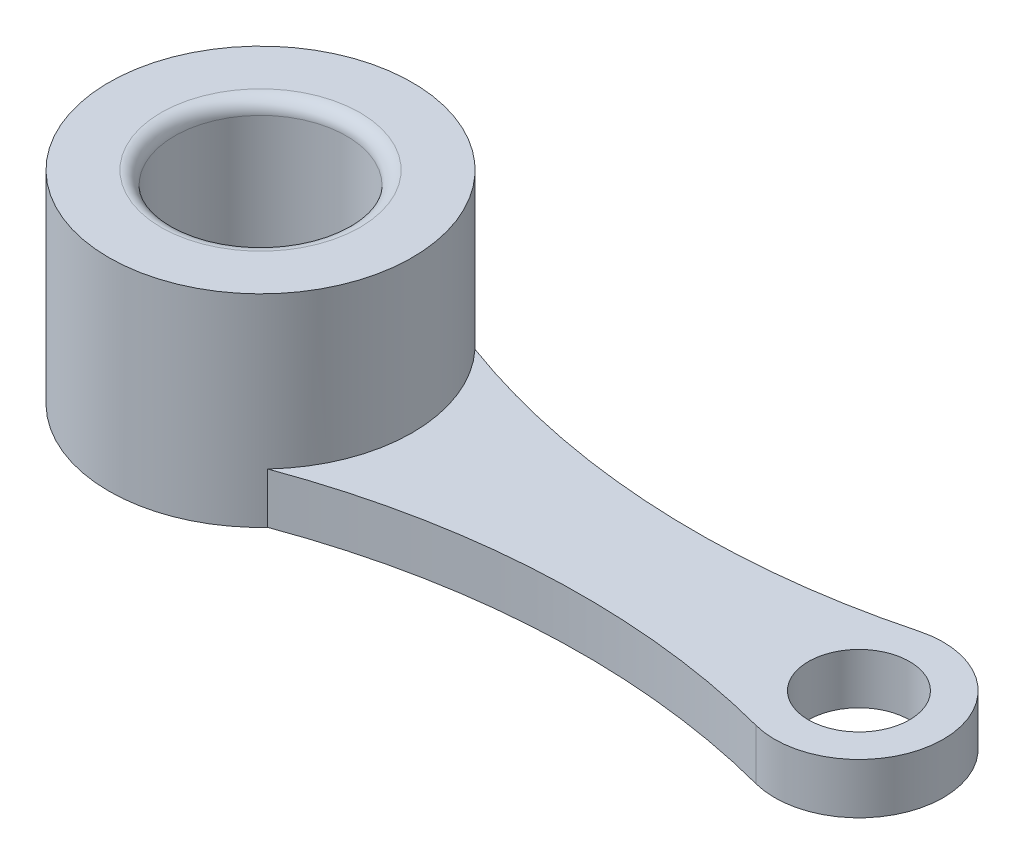
ISO-10303-21;
HEADER;
FILE_DESCRIPTION(('STEP AP214'),'2;1');
FILE_NAME('part.step','',(''),(''),'','','');
FILE_SCHEMA(('AUTOMOTIVE_DESIGN { 1 0 10303 214 1 1 1 1 }'));
ENDSEC;
DATA;
#1=APPLICATION_CONTEXT('core data for automotive mechanical design processes');
#2=APPLICATION_PROTOCOL_DEFINITION('international standard','automotive_design',2000,#1);
#3=PRODUCT_CONTEXT('',#1,'mechanical');
#4=PRODUCT('Part','Part','',(#3));
#5=PRODUCT_RELATED_PRODUCT_CATEGORY('part','',(#4));
#6=PRODUCT_DEFINITION_FORMATION('','',#4);
#7=PRODUCT_DEFINITION_CONTEXT('part definition',#1,'design');
#8=PRODUCT_DEFINITION('design','',#6,#7);
#9=PRODUCT_DEFINITION_SHAPE('','',#8);
#10=(LENGTH_UNIT() NAMED_UNIT(*) SI_UNIT(.MILLI.,.METRE.));
#11=(NAMED_UNIT(*) PLANE_ANGLE_UNIT() SI_UNIT($,.RADIAN.));
#12=(NAMED_UNIT(*) SI_UNIT($,.STERADIAN.) SOLID_ANGLE_UNIT());
#13=UNCERTAINTY_MEASURE_WITH_UNIT(LENGTH_MEASURE(1.E-05),#10,'distance_accuracy_value','');
#14=(GEOMETRIC_REPRESENTATION_CONTEXT(3) GLOBAL_UNCERTAINTY_ASSIGNED_CONTEXT((#13)) GLOBAL_UNIT_ASSIGNED_CONTEXT((#10,
#11,#12)) REPRESENTATION_CONTEXT('',''));
#15=CARTESIAN_POINT('',(0.,0.,0.));
#16=DIRECTION('',(0.,0.,1.));
#17=DIRECTION('',(1.,0.,0.));
#18=AXIS2_PLACEMENT_3D('',#15,#16,#17);
#19=CARTESIAN_POINT('',(0.,6.,0.));
#20=DIRECTION('',(0.,1.,0.));
#21=DIRECTION('',(0.,0.,1.));
#22=AXIS2_PLACEMENT_3D('',#19,#20,#21);
#23=PLANE('',#22);
#24=CARTESIAN_POINT('',(4.5,6.,-4.5));
#25=DIRECTION('',(0.,1.,0.));
#26=DIRECTION('',(0.,0.,1.));
#27=AXIS2_PLACEMENT_3D('',#24,#25,#26);
#28=CIRCLE('',#27,2.95);
#29=CARTESIAN_POINT('',(4.5,6.,-1.55));
#30=VERTEX_POINT('',#29);
#31=EDGE_CURVE('E11',#30,#30,#28,.F.);
#32=ORIENTED_EDGE('',*,*,#31,.T.);
#33=EDGE_LOOP('',(#32));
#34=FACE_BOUND('',#33,.T.);
#35=CARTESIAN_POINT('',(4.5,6.,-4.5));
#36=DIRECTION('',(0.,1.,0.));
#37=DIRECTION('',(0.,0.,1.));
#38=AXIS2_PLACEMENT_3D('',#35,#36,#37);
#39=CIRCLE('',#38,4.5);
#40=CARTESIAN_POINT('',(4.5,6.,0.));
#41=VERTEX_POINT('',#40);
#42=EDGE_CURVE('E110',#41,#41,#39,.T.);
#43=ORIENTED_EDGE('',*,*,#42,.T.);
#44=EDGE_LOOP('',(#43));
#45=FACE_BOUND('',#44,.T.);
#46=ADVANCED_FACE('F39',(#34,#45),#23,.T.);
#47=CARTESIAN_POINT('',(0.,0.,0.));
#48=DIRECTION('',(0.,1.,0.));
#49=DIRECTION('',(0.,0.,1.));
#50=AXIS2_PLACEMENT_3D('',#47,#48,#49);
#51=PLANE('',#50);
#52=CARTESIAN_POINT('',(4.5,0.,-4.5));
#53=DIRECTION('',(0.,-1.,0.));
#54=DIRECTION('',(0.,0.,-1.));
#55=AXIS2_PLACEMENT_3D('',#52,#53,#54);
#56=CIRCLE('',#55,1.);
#57=CARTESIAN_POINT('',(4.5,0.,-5.5));
#58=VERTEX_POINT('',#57);
#59=EDGE_CURVE('E199',#58,#58,#56,.T.);
#60=ORIENTED_EDGE('',*,*,#59,.F.);
#61=EDGE_LOOP('',(#60));
#62=FACE_BOUND('',#61,.T.);
#63=CARTESIAN_POINT('',(22.25,0.,-4.5));
#64=DIRECTION('',(0.,1.,0.));
#65=DIRECTION('',(0.,0.,1.));
#66=AXIS2_PLACEMENT_3D('',#63,#64,#65);
#67=CIRCLE('',#66,1.5);
#68=CARTESIAN_POINT('',(22.25,0.,-3.));
#69=VERTEX_POINT('',#68);
#70=EDGE_CURVE('E115',#69,#69,#67,.T.);
#71=ORIENTED_EDGE('',*,*,#70,.T.);
#72=EDGE_LOOP('',(#71));
#73=FACE_BOUND('',#72,.T.);
#74=CARTESIAN_POINT('',(15.7411640579091,0.,20.1776280007804));
#75=DIRECTION('',(0.,1.,0.));
#76=DIRECTION('',(0.,0.,1.));
#77=AXIS2_PLACEMENT_3D('',#74,#75,#76);
#78=CIRCLE('',#77,23.0215647848238);
#79=CARTESIAN_POINT('',(21.6124180181576,0.,-2.08266898906461));
#80=VERTEX_POINT('',#79);
#81=CARTESIAN_POINT('',(7.7863381531722,0.,-1.42591777224409));
#82=VERTEX_POINT('',#81);
#83=EDGE_CURVE('E63',#80,#82,#78,.T.);
#84=ORIENTED_EDGE('',*,*,#83,.T.);
#85=CARTESIAN_POINT('',(4.5,0.,-4.5));
#86=DIRECTION('',(0.,1.,0.));
#87=DIRECTION('',(0.,0.,1.));
#88=AXIS2_PLACEMENT_3D('',#85,#86,#87);
#89=CIRCLE('',#88,4.5);
#90=CARTESIAN_POINT('',(7.78633815317218,0.,-7.57408222775593));
#91=VERTEX_POINT('',#90);
#92=EDGE_CURVE('E56',#91,#82,#89,.T.);
#93=ORIENTED_EDGE('',*,*,#92,.F.);
#94=CARTESIAN_POINT('',(15.7411640579091,0.,-29.1776280007804));
#95=DIRECTION('',(0.,1.,0.));
#96=DIRECTION('',(0.,0.,1.));
#97=AXIS2_PLACEMENT_3D('',#94,#95,#96);
#98=CIRCLE('',#97,23.0215647848238);
#99=CARTESIAN_POINT('',(21.6124180181576,0.,-6.91733101093539));
#100=VERTEX_POINT('',#99);
#101=EDGE_CURVE('E89',#100,#91,#98,.F.);
#102=ORIENTED_EDGE('',*,*,#101,.F.);
#103=CARTESIAN_POINT('',(22.25,0.,-4.5));
#104=DIRECTION('',(0.,1.,0.));
#105=DIRECTION('',(0.,0.,1.));
#106=AXIS2_PLACEMENT_3D('',#103,#104,#105);
#107=CIRCLE('',#106,2.5);
#108=EDGE_CURVE('E195',#80,#100,#107,.T.);
#109=ORIENTED_EDGE('',*,*,#108,.F.);
#110=EDGE_LOOP('',(#84,#93,#102,#109));
#111=FACE_BOUND('',#110,.T.);
#112=ADVANCED_FACE('F149',(#62,#73,#111),#51,.F.);
#113=CARTESIAN_POINT('',(22.25,0.,-4.5));
#114=DIRECTION('',(0.,1.,0.));
#115=DIRECTION('',(0.,0.,1.));
#116=AXIS2_PLACEMENT_3D('',#113,#114,#115);
#117=CYLINDRICAL_SURFACE('',#116,1.5);
#118=ORIENTED_EDGE('',*,*,#70,.F.);
#119=EDGE_LOOP('',(#118));
#120=FACE_BOUND('',#119,.T.);
#121=CARTESIAN_POINT('',(22.25,1.5,-4.5));
#122=DIRECTION('',(0.,1.,0.));
#123=DIRECTION('',(0.,0.,1.));
#124=AXIS2_PLACEMENT_3D('',#121,#122,#123);
#125=CIRCLE('',#124,1.5);
#126=CARTESIAN_POINT('',(22.25,1.5,-3.));
#127=VERTEX_POINT('',#126);
#128=EDGE_CURVE('E109',#127,#127,#125,.F.);
#129=ORIENTED_EDGE('',*,*,#128,.F.);
#130=EDGE_LOOP('',(#129));
#131=FACE_BOUND('',#130,.T.);
#132=ADVANCED_FACE('F155',(#120,#131),#117,.F.);
#133=CARTESIAN_POINT('',(4.5,1.,-4.5));
#134=DIRECTION('',(0.,1.,0.));
#135=DIRECTION('',(0.,0.,1.));
#136=AXIS2_PLACEMENT_3D('',#133,#134,#135);
#137=CYLINDRICAL_SURFACE('',#136,2.55);
#138=CARTESIAN_POINT('',(4.5,5.6,-4.5));
#139=DIRECTION('',(0.,1.,0.));
#140=DIRECTION('',(0.,0.,1.));
#141=AXIS2_PLACEMENT_3D('',#138,#139,#140);
#142=CIRCLE('',#141,2.55);
#143=CARTESIAN_POINT('',(4.5,5.6,-1.95));
#144=VERTEX_POINT('',#143);
#145=EDGE_CURVE('E49',#144,#144,#142,.T.);
#146=ORIENTED_EDGE('',*,*,#145,.T.);
#147=EDGE_LOOP('',(#146));
#148=FACE_BOUND('',#147,.T.);
#149=CARTESIAN_POINT('',(4.5,1.,-4.5));
#150=DIRECTION('',(0.,1.,0.));
#151=DIRECTION('',(0.,0.,1.));
#152=AXIS2_PLACEMENT_3D('',#149,#150,#151);
#153=CIRCLE('',#152,2.55);
#154=CARTESIAN_POINT('',(4.5,1.,-1.95));
#155=VERTEX_POINT('',#154);
#156=EDGE_CURVE('E125',#155,#155,#153,.T.);
#157=ORIENTED_EDGE('',*,*,#156,.F.);
#158=EDGE_LOOP('',(#157));
#159=FACE_BOUND('',#158,.T.);
#160=ADVANCED_FACE('F133',(#148,#159),#137,.F.);
#161=CARTESIAN_POINT('',(4.5,1.,-4.5));
#162=DIRECTION('',(0.,1.,0.));
#163=DIRECTION('',(0.,0.,1.));
#164=AXIS2_PLACEMENT_3D('',#161,#162,#163);
#165=PLANE('',#164);
#166=CARTESIAN_POINT('',(4.5,1.,-4.5));
#167=DIRECTION('',(0.,1.,0.));
#168=DIRECTION('',(0.,0.,1.));
#169=AXIS2_PLACEMENT_3D('',#166,#167,#168);
#170=CIRCLE('',#169,1.);
#171=CARTESIAN_POINT('',(4.5,1.,-3.5));
#172=VERTEX_POINT('',#171);
#173=EDGE_CURVE('E43',#172,#172,#170,.T.);
#174=ORIENTED_EDGE('',*,*,#173,.F.);
#175=EDGE_LOOP('',(#174));
#176=FACE_BOUND('',#175,.T.);
#177=ORIENTED_EDGE('',*,*,#156,.T.);
#178=EDGE_LOOP('',(#177));
#179=FACE_BOUND('',#178,.T.);
#180=ADVANCED_FACE('F161',(#176,#179),#165,.T.);
#181=CARTESIAN_POINT('',(4.5,1.5,-4.5));
#182=DIRECTION('',(0.,1.,0.));
#183=DIRECTION('',(0.,0.,1.));
#184=AXIS2_PLACEMENT_3D('',#181,#182,#183);
#185=CYLINDRICAL_SURFACE('',#184,4.5);
#186=ORIENTED_EDGE('',*,*,#42,.F.);
#187=EDGE_LOOP('',(#186));
#188=FACE_BOUND('',#187,.T.);
#189=ORIENTED_EDGE('',*,*,#92,.T.);
#190=DIRECTION('',(0.,1.,0.));
#191=VECTOR('',#190,1.);
#192=CARTESIAN_POINT('',(7.7863381531722,-8.5,-1.42591777224409));
#193=LINE('',#192,#191);
#194=CARTESIAN_POINT('',(7.7863381531722,1.5,-1.42591777224409));
#195=VERTEX_POINT('',#194);
#196=EDGE_CURVE('E106',#82,#195,#193,.T.);
#197=ORIENTED_EDGE('',*,*,#196,.T.);
#198=CARTESIAN_POINT('',(4.5,1.5,-4.5));
#199=DIRECTION('',(0.,1.,0.));
#200=DIRECTION('',(0.,0.,1.));
#201=AXIS2_PLACEMENT_3D('',#198,#199,#200);
#202=CIRCLE('',#201,4.5);
#203=CARTESIAN_POINT('',(7.78633815317218,1.5,-7.57408222775593));
#204=VERTEX_POINT('',#203);
#205=EDGE_CURVE('E100',#195,#204,#202,.T.);
#206=ORIENTED_EDGE('',*,*,#205,.T.);
#207=DIRECTION('',(0.,1.,0.));
#208=VECTOR('',#207,1.);
#209=CARTESIAN_POINT('',(7.78633815317218,-8.5,-7.57408222775593));
#210=LINE('',#209,#208);
#211=EDGE_CURVE('E82',#91,#204,#210,.T.);
#212=ORIENTED_EDGE('',*,*,#211,.F.);
#213=EDGE_LOOP('',(#189,#197,#206,#212));
#214=FACE_BOUND('',#213,.T.);
#215=ADVANCED_FACE('F105',(#188,#214),#185,.T.);
#216=CARTESIAN_POINT('',(0.,1.5,0.));
#217=DIRECTION('',(0.,1.,0.));
#218=DIRECTION('',(0.,0.,1.));
#219=AXIS2_PLACEMENT_3D('',#216,#217,#218);
#220=PLANE('',#219);
#221=CARTESIAN_POINT('',(15.7411640579091,1.5,20.1776280007804));
#222=DIRECTION('',(0.,1.,0.));
#223=DIRECTION('',(0.,0.,1.));
#224=AXIS2_PLACEMENT_3D('',#221,#222,#223);
#225=CIRCLE('',#224,23.0215647848238);
#226=CARTESIAN_POINT('',(21.6124180181576,1.5,-2.08266898906461));
#227=VERTEX_POINT('',#226);
#228=EDGE_CURVE('E93',#227,#195,#225,.T.);
#229=ORIENTED_EDGE('',*,*,#228,.F.);
#230=CARTESIAN_POINT('',(22.25,1.5,-4.5));
#231=DIRECTION('',(0.,1.,0.));
#232=DIRECTION('',(0.,0.,1.));
#233=AXIS2_PLACEMENT_3D('',#230,#231,#232);
#234=CIRCLE('',#233,2.5);
#235=CARTESIAN_POINT('',(21.6124180181576,1.5,-6.91733101093539));
#236=VERTEX_POINT('',#235);
#237=EDGE_CURVE('E102',#227,#236,#234,.T.);
#238=ORIENTED_EDGE('',*,*,#237,.T.);
#239=CARTESIAN_POINT('',(15.7411640579091,1.5,-29.1776280007804));
#240=DIRECTION('',(0.,1.,0.));
#241=DIRECTION('',(0.,0.,1.));
#242=AXIS2_PLACEMENT_3D('',#239,#240,#241);
#243=CIRCLE('',#242,23.0215647848238);
#244=EDGE_CURVE('E86',#236,#204,#243,.F.);
#245=ORIENTED_EDGE('',*,*,#244,.T.);
#246=ORIENTED_EDGE('',*,*,#205,.F.);
#247=EDGE_LOOP('',(#229,#238,#245,#246));
#248=FACE_BOUND('',#247,.T.);
#249=ORIENTED_EDGE('',*,*,#128,.T.);
#250=EDGE_LOOP('',(#249));
#251=FACE_BOUND('',#250,.T.);
#252=ADVANCED_FACE('F98',(#248,#251),#220,.T.);
#253=CARTESIAN_POINT('',(4.5,5.6,-4.5));
#254=DIRECTION('',(0.,1.,0.));
#255=DIRECTION('',(0.,0.,1.));
#256=AXIS2_PLACEMENT_3D('',#253,#254,#255);
#257=TOROIDAL_SURFACE('',#256,2.95,0.4);
#258=ORIENTED_EDGE('',*,*,#31,.F.);
#259=EDGE_LOOP('',(#258));
#260=FACE_BOUND('',#259,.T.);
#261=ORIENTED_EDGE('',*,*,#145,.F.);
#262=EDGE_LOOP('',(#261));
#263=FACE_BOUND('',#262,.T.);
#264=ADVANCED_FACE('F41',(#260,#263),#257,.T.);
#265=CARTESIAN_POINT('',(4.5,6.,-4.5));
#266=DIRECTION('',(0.,-1.,0.));
#267=DIRECTION('',(0.,0.,-1.));
#268=AXIS2_PLACEMENT_3D('',#265,#266,#267);
#269=CYLINDRICAL_SURFACE('',#268,1.);
#270=ORIENTED_EDGE('',*,*,#173,.T.);
#271=EDGE_LOOP('',(#270));
#272=FACE_BOUND('',#271,.T.);
#273=ORIENTED_EDGE('',*,*,#59,.T.);
#274=EDGE_LOOP('',(#273));
#275=FACE_BOUND('',#274,.T.);
#276=ADVANCED_FACE('F137',(#272,#275),#269,.F.);
#277=CARTESIAN_POINT('',(15.7411640579091,-8.5,20.1776280007804));
#278=DIRECTION('',(0.,1.,0.));
#279=DIRECTION('',(0.,0.,1.));
#280=AXIS2_PLACEMENT_3D('',#277,#278,#279);
#281=CYLINDRICAL_SURFACE('',#280,23.0215647848238);
#282=DIRECTION('',(0.,1.,0.));
#283=VECTOR('',#282,1.);
#284=CARTESIAN_POINT('',(21.6124180181576,-8.5,-2.08266898906461));
#285=LINE('',#284,#283);
#286=EDGE_CURVE('E180',#80,#227,#285,.T.);
#287=ORIENTED_EDGE('',*,*,#286,.T.);
#288=ORIENTED_EDGE('',*,*,#228,.T.);
#289=ORIENTED_EDGE('',*,*,#196,.F.);
#290=ORIENTED_EDGE('',*,*,#83,.F.);
#291=EDGE_LOOP('',(#287,#288,#289,#290));
#292=FACE_BOUND('',#291,.T.);
#293=ADVANCED_FACE('F143',(#292),#281,.F.);
#294=CARTESIAN_POINT('',(22.25,-8.5,-4.5));
#295=DIRECTION('',(0.,1.,0.));
#296=DIRECTION('',(0.,0.,1.));
#297=AXIS2_PLACEMENT_3D('',#294,#295,#296);
#298=CYLINDRICAL_SURFACE('',#297,2.5);
#299=ORIENTED_EDGE('',*,*,#108,.T.);
#300=DIRECTION('',(0.,1.,0.));
#301=VECTOR('',#300,1.);
#302=CARTESIAN_POINT('',(21.6124180181576,-8.5,-6.91733101093539));
#303=LINE('',#302,#301);
#304=EDGE_CURVE('E92',#100,#236,#303,.T.);
#305=ORIENTED_EDGE('',*,*,#304,.T.);
#306=ORIENTED_EDGE('',*,*,#237,.F.);
#307=ORIENTED_EDGE('',*,*,#286,.F.);
#308=EDGE_LOOP('',(#299,#305,#306,#307));
#309=FACE_BOUND('',#308,.T.);
#310=ADVANCED_FACE('F173',(#309),#298,.T.);
#311=CARTESIAN_POINT('',(15.7411640579091,-8.5,-29.1776280007804));
#312=DIRECTION('',(0.,1.,0.));
#313=DIRECTION('',(0.,0.,1.));
#314=AXIS2_PLACEMENT_3D('',#311,#312,#313);
#315=CYLINDRICAL_SURFACE('',#314,23.0215647848238);
#316=ORIENTED_EDGE('',*,*,#101,.T.);
#317=ORIENTED_EDGE('',*,*,#211,.T.);
#318=ORIENTED_EDGE('',*,*,#244,.F.);
#319=ORIENTED_EDGE('',*,*,#304,.F.);
#320=EDGE_LOOP('',(#316,#317,#318,#319));
#321=FACE_BOUND('',#320,.T.);
#322=ADVANCED_FACE('F84',(#321),#315,.F.);
#323=CLOSED_SHELL('',(#46,#112,#132,#160,#180,#215,#252,#264,#276,#293,#310,#322));
#324=MANIFOLD_SOLID_BREP('B2',#323);
#325=ADVANCED_BREP_SHAPE_REPRESENTATION('',(#18,#324),#14);
#326=SHAPE_DEFINITION_REPRESENTATION(#9,#325);
ENDSEC;
END-ISO-10303-21;
